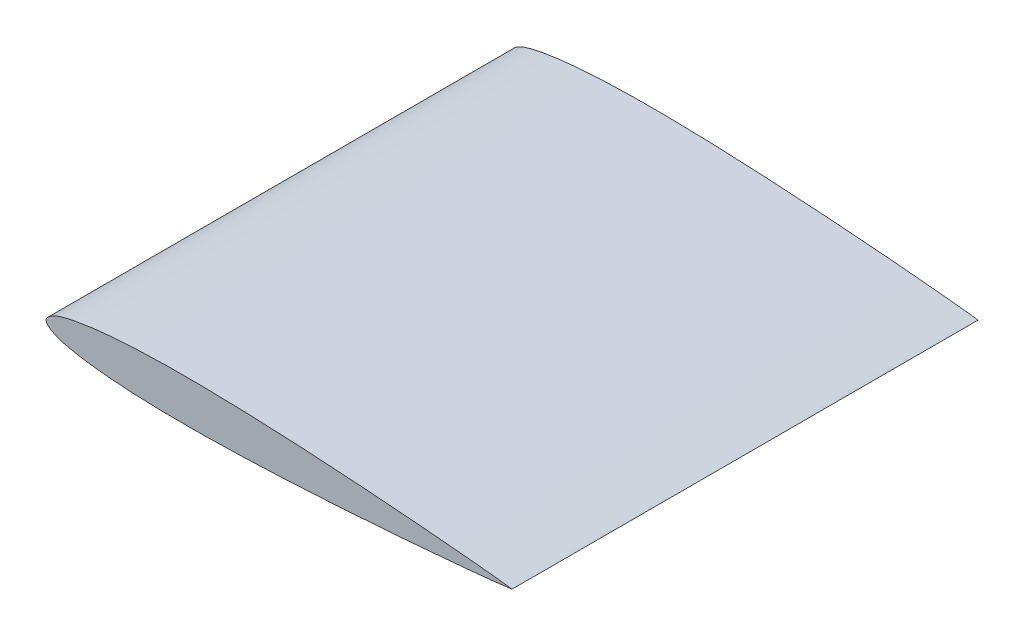
ISO-10303-21;
HEADER;
FILE_DESCRIPTION(('STEP AP214'),'2;1');
FILE_NAME('part.step','',(''),(''),'','','');
FILE_SCHEMA(('AUTOMOTIVE_DESIGN { 1 0 10303 214 1 1 1 1 }'));
ENDSEC;
DATA;
#1=APPLICATION_CONTEXT('core data for automotive mechanical design processes');
#2=APPLICATION_PROTOCOL_DEFINITION('international standard','automotive_design',2000,#1);
#3=PRODUCT_CONTEXT('',#1,'mechanical');
#4=PRODUCT('Part','Part','',(#3));
#5=PRODUCT_RELATED_PRODUCT_CATEGORY('part','',(#4));
#6=PRODUCT_DEFINITION_FORMATION('','',#4);
#7=PRODUCT_DEFINITION_CONTEXT('part definition',#1,'design');
#8=PRODUCT_DEFINITION('design','',#6,#7);
#9=PRODUCT_DEFINITION_SHAPE('','',#8);
#10=(LENGTH_UNIT() NAMED_UNIT(*) SI_UNIT(.MILLI.,.METRE.));
#11=(NAMED_UNIT(*) PLANE_ANGLE_UNIT() SI_UNIT($,.RADIAN.));
#12=(NAMED_UNIT(*) SI_UNIT($,.STERADIAN.) SOLID_ANGLE_UNIT());
#13=UNCERTAINTY_MEASURE_WITH_UNIT(LENGTH_MEASURE(1.E-05),#10,'distance_accuracy_value','');
#14=(GEOMETRIC_REPRESENTATION_CONTEXT(3) GLOBAL_UNCERTAINTY_ASSIGNED_CONTEXT((#13)) GLOBAL_UNIT_ASSIGNED_CONTEXT((#10,
#11,#12)) REPRESENTATION_CONTEXT('',''));
#15=CARTESIAN_POINT('',(0.,0.,0.));
#16=DIRECTION('',(0.,0.,1.));
#17=DIRECTION('',(1.,0.,0.));
#18=AXIS2_PLACEMENT_3D('',#15,#16,#17);
#19=CARTESIAN_POINT('',(73.1858486080855,0.0268568610166776,100.));
#20=CARTESIAN_POINT('',(73.1858486080855,0.0459612255792362,100.));
#21=CARTESIAN_POINT('',(72.2723599764539,0.121970755537362,100.));
#22=CARTESIAN_POINT('',(71.3354828776833,0.280581867658345,100.));
#23=CARTESIAN_POINT('',(69.0597403990146,0.523745586237919,100.));
#24=CARTESIAN_POINT('',(66.2636666873828,0.825580781680082,100.));
#25=CARTESIAN_POINT('',(62.6204016385943,1.1797818229237,100.));
#26=CARTESIAN_POINT('',(58.3430080130119,1.57066586648824,100.));
#27=CARTESIAN_POINT('',(53.4502004712932,1.99068467417343,100.));
#28=CARTESIAN_POINT('',(48.0443640452903,2.42754760938701,100.));
#29=CARTESIAN_POINT('',(42.2116857727235,2.86380494436679,100.));
#30=CARTESIAN_POINT('',(36.0538672328683,3.28653009253716,100.));
#31=CARTESIAN_POINT('',(29.6758271163602,3.67627135283716,100.));
#32=CARTESIAN_POINT('',(23.1867720356223,4.01652383390182,100.));
#33=CARTESIAN_POINT('',(16.6974990804297,4.2870613666994,100.));
#34=CARTESIAN_POINT('',(11.3392841107281,4.44334638413415,100.));
#35=CARTESIAN_POINT('',(7.13606941855702,4.51514262370983,100.));
#36=CARTESIAN_POINT('',(4.07824064560424,4.54062277781031,100.));
#37=CARTESIAN_POINT('',(1.10201864589366,4.53706351141302,100.));
#38=CARTESIAN_POINT('',(-1.77986710332078,4.49875155075596,100.));
#39=CARTESIAN_POINT('',(-4.55485139565114,4.43150133386039,100.));
#40=CARTESIAN_POINT('',(-7.21082184758776,4.32993894500414,100.));
#41=CARTESIAN_POINT('',(-9.73661592137332,4.19776250547074,100.));
#42=CARTESIAN_POINT('',(-12.1217518837519,4.03189086365417,100.));
#43=CARTESIAN_POINT('',(-14.3561161870996,3.83513071098493,100.));
#44=CARTESIAN_POINT('',(-16.4294188315106,3.60575928628965,100.));
#45=CARTESIAN_POINT('',(-18.3330179003363,3.34814933850125,100.));
#46=CARTESIAN_POINT('',(-20.0594702318735,3.06894185552809,100.));
#47=CARTESIAN_POINT('',(-21.6015856480624,2.76938739939077,100.));
#48=CARTESIAN_POINT('',(-22.9543545251057,2.45052409910988,100.));
#49=CARTESIAN_POINT('',(-24.111370696318,2.10161359061607,100.));
#50=CARTESIAN_POINT('',(-25.0701228256049,1.71619336593622,100.));
#51=CARTESIAN_POINT('',(-25.8218384249829,1.2909351815701,100.));
#52=CARTESIAN_POINT('',(-26.3624136465879,0.846871786677417,100.));
#53=CARTESIAN_POINT('',(-26.7000066395946,0.439870052818282,100.));
#54=CARTESIAN_POINT('',(-26.8628886137435,0.0268568609688025,100.));
#55=CARTESIAN_POINT('',(-26.7000066395942,-0.386156330880547,100.));
#56=CARTESIAN_POINT('',(-26.3624136465871,-0.79315806473934,100.));
#57=CARTESIAN_POINT('',(-25.8218384249817,-1.23722145963153,100.));
#58=CARTESIAN_POINT('',(-25.0701228256033,-1.66247964399691,100.));
#59=CARTESIAN_POINT('',(-24.111370696316,-2.04789986867585,100.));
#60=CARTESIAN_POINT('',(-22.9543545251034,-2.39681037716855,100.));
#61=CARTESIAN_POINT('',(-21.6015856480598,-2.71567367744814,100.));
#62=CARTESIAN_POINT('',(-20.0594702318706,-3.01522813358399,100.));
#63=CARTESIAN_POINT('',(-18.3330179003331,-3.29443561655549,100.));
#64=CARTESIAN_POINT('',(-16.4294188315071,-3.55204556434207,100.));
#65=CARTESIAN_POINT('',(-14.3561161870959,-3.78141698903537,100.));
#66=CARTESIAN_POINT('',(-12.1217518837481,-3.97817714170247,100.));
#67=CARTESIAN_POINT('',(-9.73661592136931,-4.14404878351676,100.));
#68=CARTESIAN_POINT('',(-7.21082184758366,-4.27622522304774,100.));
#69=CARTESIAN_POINT('',(-4.55485139564696,-4.37778761190145,100.));
#70=CARTESIAN_POINT('',(-1.77986710331647,-4.44503782879436,100.));
#71=CARTESIAN_POINT('',(1.102018645898,-4.48334978944866,100.));
#72=CARTESIAN_POINT('',(4.07824064560856,-4.48690905584311,100.));
#73=CARTESIAN_POINT('',(7.13606941856132,-4.4614289017397,100.));
#74=CARTESIAN_POINT('',(11.3392841107323,-4.38963266215999,100.));
#75=CARTESIAN_POINT('',(16.6974990804337,-4.23334764472011,100.));
#76=CARTESIAN_POINT('',(23.1867720356261,-3.96281011191631,100.));
#77=CARTESIAN_POINT('',(29.6758271163637,-3.62255763084545,100.));
#78=CARTESIAN_POINT('',(36.0538672328714,-3.23281637053935,100.));
#79=CARTESIAN_POINT('',(42.2116857727262,-2.81009122236308,100.));
#80=CARTESIAN_POINT('',(48.0443640452926,-2.37383388737773,100.));
#81=CARTESIAN_POINT('',(53.4502004712951,-1.93697095215897,100.));
#82=CARTESIAN_POINT('',(58.3430080130134,-1.51695214446909,100.));
#83=CARTESIAN_POINT('',(62.6204016385954,-1.12606810090046,100.));
#84=CARTESIAN_POINT('',(66.2636666873836,-0.771867059653352,100.));
#85=CARTESIAN_POINT('',(69.059740399015,-0.470031864208512,100.));
#86=CARTESIAN_POINT('',(71.3354828776836,-0.226868145626765,100.));
#87=CARTESIAN_POINT('',(72.272359976454,-0.0682570335048732,100.));
#88=CARTESIAN_POINT('',(73.1858486080855,0.00775249645411749,100.));
#89=CARTESIAN_POINT('',(73.1858486080855,0.0268568610166776,100.));
#90=B_SPLINE_CURVE_WITH_KNOTS('',3,(#19,#20,#21,#22,#23,#24,#25,#26,#27,#28,#29,#30,#31,#32,#33,
#34,#35,#36,#37,#38,#39,#40,#41,#42,#43,#44,#45,#46,#47,#48,#49,#50,#51,#52,#53,#54,#55,#56,#57,
#58,#59,#60,#61,#62,#63,#64,#65,#66,#67,#68,#69,#70,#71,#72,#73,#74,#75,#76,#77,#78,#79,#80,#81,
#82,#83,#84,#85,#86,#87,#88,#89),.UNSPECIFIED.,.T.,.F.,(4,1,1,1,1,1,1,1,1,1,1,1,1,1,1,1,1,1,1,1,
1,1,1,1,1,1,1,1,1,1,1,1,1,1,1,1,1,1,1,1,1,1,1,1,1,1,1,1,1,1,1,1,1,1,1,1,1,1,1,1,1,1,1,1,1,1,1,1,
4),(0.,0.00213342749536812,0.00848815570874325,0.0189444871418497,0.033319113775561,
0.0513562940971698,0.0727560928984786,0.0971408174352605,0.124097488782512,0.153162556777752,
0.183833917661664,0.21558937445911,0.247878194577004,0.280150867864074,0.311860397032406,
0.327332942728477,0.342462846119516,0.35718710244681,0.37144811835162,0.385183441042633,
0.398331272584713,0.410844637191414,0.422672607167312,0.433769314473499,0.444090175228778,
0.453589411782156,0.462240439844477,0.470010037325291,0.476870984676999,0.482833353063501,
0.487908551351284,0.492155163583175,0.495592273393841,0.498196358984712,0.5,0.501803641015288,
0.504407726606159,0.507844836416825,0.512091448648716,0.517166646936499,0.523129015323,
0.529989962674709,0.537759560155523,0.546410588217843,0.555909824771222,0.566230685526501,
0.577327392832688,0.589155362808586,0.601668727415287,0.614816558957367,0.628551881648379,
0.642812897553189,0.657537153880484,0.672667057271523,0.688139602967594,0.719849132135926,
0.752121805422995,0.784410625540889,0.816166082338336,0.846837443222248,0.875902511217488,
0.902859182564739,0.927243907101521,0.94864370590283,0.966680886224439,0.98105551285815,
0.991511844291257,0.997866572504632,1.),.UNSPECIFIED.);
#91=DIRECTION('',(0.,0.,-1.));
#92=VECTOR('',#91,1.);
#93=SURFACE_OF_LINEAR_EXTRUSION('',#90,#92);
#94=CARTESIAN_POINT('',(73.1858486080855,0.0268568610166776,100.));
#95=VERTEX_POINT('',#94);
#96=EDGE_CURVE('E10',#95,#95,#90,.T.);
#97=ORIENTED_EDGE('',*,*,#96,.F.);
#98=EDGE_LOOP('',(#97));
#99=FACE_BOUND('',#98,.T.);
#100=CARTESIAN_POINT('',(73.1858486080855,0.0268568610166776,0.));
#101=CARTESIAN_POINT('',(73.1858486080855,0.0459612255792362,0.));
#102=CARTESIAN_POINT('',(72.2723599764539,0.121970755537362,0.));
#103=CARTESIAN_POINT('',(71.3354828776833,0.280581867658345,0.));
#104=CARTESIAN_POINT('',(69.0597403990146,0.523745586237919,0.));
#105=CARTESIAN_POINT('',(66.2636666873828,0.825580781680082,0.));
#106=CARTESIAN_POINT('',(62.6204016385943,1.1797818229237,0.));
#107=CARTESIAN_POINT('',(58.3430080130119,1.57066586648824,0.));
#108=CARTESIAN_POINT('',(53.4502004712932,1.99068467417343,0.));
#109=CARTESIAN_POINT('',(48.0443640452903,2.42754760938701,0.));
#110=CARTESIAN_POINT('',(42.2116857727235,2.86380494436679,0.));
#111=CARTESIAN_POINT('',(36.0538672328683,3.28653009253716,0.));
#112=CARTESIAN_POINT('',(29.6758271163602,3.67627135283716,0.));
#113=CARTESIAN_POINT('',(23.1867720356223,4.01652383390182,0.));
#114=CARTESIAN_POINT('',(16.6974990804297,4.2870613666994,0.));
#115=CARTESIAN_POINT('',(11.3392841107281,4.44334638413415,0.));
#116=CARTESIAN_POINT('',(7.13606941855702,4.51514262370983,0.));
#117=CARTESIAN_POINT('',(4.07824064560424,4.54062277781031,0.));
#118=CARTESIAN_POINT('',(1.10201864589366,4.53706351141302,0.));
#119=CARTESIAN_POINT('',(-1.77986710332078,4.49875155075596,0.));
#120=CARTESIAN_POINT('',(-4.55485139565114,4.43150133386039,0.));
#121=CARTESIAN_POINT('',(-7.21082184758776,4.32993894500414,0.));
#122=CARTESIAN_POINT('',(-9.73661592137332,4.19776250547074,0.));
#123=CARTESIAN_POINT('',(-12.1217518837519,4.03189086365417,0.));
#124=CARTESIAN_POINT('',(-14.3561161870996,3.83513071098493,0.));
#125=CARTESIAN_POINT('',(-16.4294188315106,3.60575928628965,0.));
#126=CARTESIAN_POINT('',(-18.3330179003363,3.34814933850125,0.));
#127=CARTESIAN_POINT('',(-20.0594702318735,3.06894185552809,0.));
#128=CARTESIAN_POINT('',(-21.6015856480624,2.76938739939077,0.));
#129=CARTESIAN_POINT('',(-22.9543545251057,2.45052409910988,0.));
#130=CARTESIAN_POINT('',(-24.111370696318,2.10161359061607,0.));
#131=CARTESIAN_POINT('',(-25.0701228256049,1.71619336593622,0.));
#132=CARTESIAN_POINT('',(-25.8218384249829,1.2909351815701,0.));
#133=CARTESIAN_POINT('',(-26.3624136465879,0.846871786677417,0.));
#134=CARTESIAN_POINT('',(-26.7000066395946,0.439870052818282,0.));
#135=CARTESIAN_POINT('',(-26.8628886137435,0.0268568609688025,0.));
#136=CARTESIAN_POINT('',(-26.7000066395942,-0.386156330880547,0.));
#137=CARTESIAN_POINT('',(-26.3624136465871,-0.79315806473934,0.));
#138=CARTESIAN_POINT('',(-25.8218384249817,-1.23722145963153,0.));
#139=CARTESIAN_POINT('',(-25.0701228256033,-1.66247964399691,0.));
#140=CARTESIAN_POINT('',(-24.111370696316,-2.04789986867585,0.));
#141=CARTESIAN_POINT('',(-22.9543545251034,-2.39681037716855,0.));
#142=CARTESIAN_POINT('',(-21.6015856480598,-2.71567367744814,0.));
#143=CARTESIAN_POINT('',(-20.0594702318706,-3.01522813358399,0.));
#144=CARTESIAN_POINT('',(-18.3330179003331,-3.29443561655549,0.));
#145=CARTESIAN_POINT('',(-16.4294188315071,-3.55204556434207,0.));
#146=CARTESIAN_POINT('',(-14.3561161870959,-3.78141698903537,0.));
#147=CARTESIAN_POINT('',(-12.1217518837481,-3.97817714170247,0.));
#148=CARTESIAN_POINT('',(-9.73661592136931,-4.14404878351676,0.));
#149=CARTESIAN_POINT('',(-7.21082184758366,-4.27622522304774,0.));
#150=CARTESIAN_POINT('',(-4.55485139564696,-4.37778761190145,0.));
#151=CARTESIAN_POINT('',(-1.77986710331647,-4.44503782879436,0.));
#152=CARTESIAN_POINT('',(1.102018645898,-4.48334978944866,0.));
#153=CARTESIAN_POINT('',(4.07824064560856,-4.48690905584311,0.));
#154=CARTESIAN_POINT('',(7.13606941856132,-4.4614289017397,0.));
#155=CARTESIAN_POINT('',(11.3392841107323,-4.38963266215999,0.));
#156=CARTESIAN_POINT('',(16.6974990804337,-4.23334764472011,0.));
#157=CARTESIAN_POINT('',(23.1867720356261,-3.96281011191631,0.));
#158=CARTESIAN_POINT('',(29.6758271163637,-3.62255763084545,0.));
#159=CARTESIAN_POINT('',(36.0538672328714,-3.23281637053935,0.));
#160=CARTESIAN_POINT('',(42.2116857727262,-2.81009122236308,0.));
#161=CARTESIAN_POINT('',(48.0443640452926,-2.37383388737773,0.));
#162=CARTESIAN_POINT('',(53.4502004712951,-1.93697095215897,0.));
#163=CARTESIAN_POINT('',(58.3430080130134,-1.51695214446909,0.));
#164=CARTESIAN_POINT('',(62.6204016385954,-1.12606810090046,0.));
#165=CARTESIAN_POINT('',(66.2636666873836,-0.771867059653352,0.));
#166=CARTESIAN_POINT('',(69.059740399015,-0.470031864208512,0.));
#167=CARTESIAN_POINT('',(71.3354828776836,-0.226868145626765,0.));
#168=CARTESIAN_POINT('',(72.272359976454,-0.0682570335048732,0.));
#169=CARTESIAN_POINT('',(73.1858486080855,0.00775249645411749,0.));
#170=CARTESIAN_POINT('',(73.1858486080855,0.0268568610166776,0.));
#171=B_SPLINE_CURVE_WITH_KNOTS('',3,(#100,#101,#102,#103,#104,#105,#106,#107,#108,#109,#110,
#111,#112,#113,#114,#115,#116,#117,#118,#119,#120,#121,#122,#123,#124,#125,#126,#127,#128,#129,
#130,#131,#132,#133,#134,#135,#136,#137,#138,#139,#140,#141,#142,#143,#144,#145,#146,#147,#148,
#149,#150,#151,#152,#153,#154,#155,#156,#157,#158,#159,#160,#161,#162,#163,#164,#165,#166,#167,
#168,#169,#170),.UNSPECIFIED.,.T.,.F.,(4,1,1,1,1,1,1,1,1,1,1,1,1,1,1,1,1,1,1,1,1,1,1,1,1,1,1,1,
1,1,1,1,1,1,1,1,1,1,1,1,1,1,1,1,1,1,1,1,1,1,1,1,1,1,1,1,1,1,1,1,1,1,1,1,1,1,1,1,4),(0.,
0.00213342749536812,0.00848815570874325,0.0189444871418497,0.033319113775561,0.0513562940971698,
0.0727560928984786,0.0971408174352605,0.124097488782512,0.153162556777752,0.183833917661664,
0.21558937445911,0.247878194577004,0.280150867864074,0.311860397032406,0.327332942728477,
0.342462846119516,0.35718710244681,0.37144811835162,0.385183441042633,0.398331272584713,
0.410844637191414,0.422672607167312,0.433769314473499,0.444090175228778,0.453589411782156,
0.462240439844477,0.470010037325291,0.476870984676999,0.482833353063501,0.487908551351284,
0.492155163583175,0.495592273393841,0.498196358984712,0.5,0.501803641015288,0.504407726606159,
0.507844836416825,0.512091448648716,0.517166646936499,0.523129015323,0.529989962674709,
0.537759560155523,0.546410588217843,0.555909824771222,0.566230685526501,0.577327392832688,
0.589155362808586,0.601668727415287,0.614816558957367,0.628551881648379,0.642812897553189,
0.657537153880484,0.672667057271523,0.688139602967594,0.719849132135926,0.752121805422995,
0.784410625540889,0.816166082338336,0.846837443222248,0.875902511217488,0.902859182564739,
0.927243907101521,0.94864370590283,0.966680886224439,0.98105551285815,0.991511844291257,
0.997866572504632,1.),.UNSPECIFIED.);
#172=CARTESIAN_POINT('',(73.1858486080855,0.0268568610166776,0.));
#173=VERTEX_POINT('',#172);
#174=EDGE_CURVE('E47',#173,#173,#171,.T.);
#175=ORIENTED_EDGE('',*,*,#174,.T.);
#176=EDGE_LOOP('',(#175));
#177=FACE_BOUND('',#176,.T.);
#178=ADVANCED_FACE('F43',(#99,#177),#93,.F.);
#179=CARTESIAN_POINT('',(-26.8155913634227,0.0268568609687955,100.));
#180=DIRECTION('',(0.,0.,-1.));
#181=DIRECTION('',(-1.,0.,0.));
#182=AXIS2_PLACEMENT_3D('',#179,#180,#181);
#183=PLANE('',#182);
#184=ORIENTED_EDGE('',*,*,#96,.T.);
#185=EDGE_LOOP('',(#184));
#186=FACE_BOUND('',#185,.T.);
#187=ADVANCED_FACE('F68',(#186),#183,.F.);
#188=CARTESIAN_POINT('',(-26.8155913634227,0.0268568609687955,0.));
#189=DIRECTION('',(0.,0.,-1.));
#190=DIRECTION('',(-1.,0.,0.));
#191=AXIS2_PLACEMENT_3D('',#188,#189,#190);
#192=PLANE('',#191);
#193=ORIENTED_EDGE('',*,*,#174,.F.);
#194=EDGE_LOOP('',(#193));
#195=FACE_BOUND('',#194,.T.);
#196=ADVANCED_FACE('F66',(#195),#192,.T.);
#197=CLOSED_SHELL('',(#178,#187,#196));
#198=MANIFOLD_SOLID_BREP('B2',#197);
#199=ADVANCED_BREP_SHAPE_REPRESENTATION('',(#18,#198),#14);
#200=SHAPE_DEFINITION_REPRESENTATION(#9,#199);
ENDSEC;
END-ISO-10303-21;
